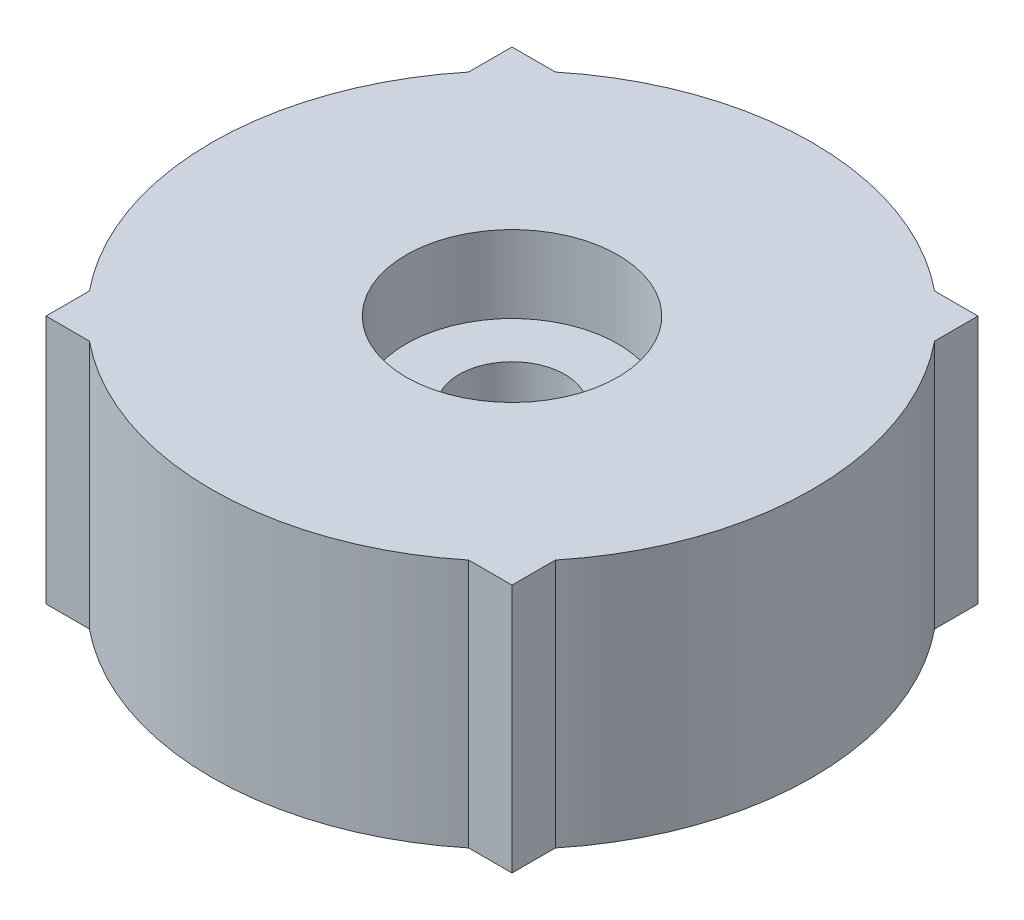
ISO-10303-21;
HEADER;
FILE_DESCRIPTION(('STEP AP214'),'2;1');
FILE_NAME('part.step','',(''),(''),'','','');
FILE_SCHEMA(('AUTOMOTIVE_DESIGN { 1 0 10303 214 1 1 1 1 }'));
ENDSEC;
DATA;
#1=APPLICATION_CONTEXT('core data for automotive mechanical design processes');
#2=APPLICATION_PROTOCOL_DEFINITION('international standard','automotive_design',2000,#1);
#3=PRODUCT_CONTEXT('',#1,'mechanical');
#4=PRODUCT('Part','Part','',(#3));
#5=PRODUCT_RELATED_PRODUCT_CATEGORY('part','',(#4));
#6=PRODUCT_DEFINITION_FORMATION('','',#4);
#7=PRODUCT_DEFINITION_CONTEXT('part definition',#1,'design');
#8=PRODUCT_DEFINITION('design','',#6,#7);
#9=PRODUCT_DEFINITION_SHAPE('','',#8);
#10=(LENGTH_UNIT() NAMED_UNIT(*) SI_UNIT(.MILLI.,.METRE.));
#11=(NAMED_UNIT(*) PLANE_ANGLE_UNIT() SI_UNIT($,.RADIAN.));
#12=(NAMED_UNIT(*) SI_UNIT($,.STERADIAN.) SOLID_ANGLE_UNIT());
#13=UNCERTAINTY_MEASURE_WITH_UNIT(LENGTH_MEASURE(1.E-05),#10,'distance_accuracy_value','');
#14=(GEOMETRIC_REPRESENTATION_CONTEXT(3) GLOBAL_UNCERTAINTY_ASSIGNED_CONTEXT((#13)) GLOBAL_UNIT_ASSIGNED_CONTEXT((#10,
#11,#12)) REPRESENTATION_CONTEXT('',''));
#15=CARTESIAN_POINT('',(0.,0.,0.));
#16=DIRECTION('',(0.,0.,1.));
#17=DIRECTION('',(1.,0.,0.));
#18=AXIS2_PLACEMENT_3D('',#15,#16,#17);
#19=CARTESIAN_POINT('',(-6.05000000000001,4.,6.05000000000002));
#20=DIRECTION('',(0.,0.,-1.));
#21=DIRECTION('',(-1.,0.,0.));
#22=AXIS2_PLACEMENT_3D('',#19,#20,#21);
#23=PLANE('',#22);
#24=DIRECTION('',(1.,0.,0.));
#25=VECTOR('',#24,1.);
#26=CARTESIAN_POINT('',(-6.05000000000001,4.,6.05000000000002));
#27=LINE('',#26,#25);
#28=CARTESIAN_POINT('',(4.92315955459497,4.,6.05000000000002));
#29=VERTEX_POINT('',#28);
#30=CARTESIAN_POINT('',(6.05,4.,6.05000000000002));
#31=VERTEX_POINT('',#30);
#32=EDGE_CURVE('E305',#29,#31,#27,.T.);
#33=ORIENTED_EDGE('',*,*,#32,.F.);
#34=DIRECTION('',(0.,-1.,0.));
#35=VECTOR('',#34,1.);
#36=CARTESIAN_POINT('',(4.92315955459497,26.0617315730203,6.05000000000002));
#37=LINE('',#36,#35);
#38=CARTESIAN_POINT('',(4.923159554595,-2.475,6.05));
#39=VERTEX_POINT('',#38);
#40=EDGE_CURVE('E430',#29,#39,#37,.T.);
#41=ORIENTED_EDGE('',*,*,#40,.T.);
#42=DIRECTION('',(-1.,0.,0.));
#43=VECTOR('',#42,1.);
#44=CARTESIAN_POINT('',(-6.05000000000001,-2.475,6.05));
#45=LINE('',#44,#43);
#46=CARTESIAN_POINT('',(6.05,-2.475,6.05));
#47=VERTEX_POINT('',#46);
#48=EDGE_CURVE('E260',#47,#39,#45,.T.);
#49=ORIENTED_EDGE('',*,*,#48,.F.);
#50=DIRECTION('',(0.,-1.,0.));
#51=VECTOR('',#50,1.);
#52=CARTESIAN_POINT('',(6.05,4.,6.05000000000002));
#53=LINE('',#52,#51);
#54=EDGE_CURVE('E320',#31,#47,#53,.T.);
#55=ORIENTED_EDGE('',*,*,#54,.F.);
#56=EDGE_LOOP('',(#33,#41,#49,#55));
#57=FACE_BOUND('',#56,.T.);
#58=ADVANCED_FACE('F92',(#57),#23,.F.);
#59=CARTESIAN_POINT('',(-6.05000000000001,4.,-6.05));
#60=DIRECTION('',(0.,0.,-1.));
#61=DIRECTION('',(-1.,0.,0.));
#62=AXIS2_PLACEMENT_3D('',#59,#60,#61);
#63=PLANE('',#62);
#64=DIRECTION('',(0.,-1.,0.));
#65=VECTOR('',#64,1.);
#66=CARTESIAN_POINT('',(4.92315955459499,26.0617315730203,-6.05));
#67=LINE('',#66,#65);
#68=CARTESIAN_POINT('',(4.92315955459499,4.,-6.05));
#69=VERTEX_POINT('',#68);
#70=CARTESIAN_POINT('',(4.92315955459502,-2.475,-6.04999999999998));
#71=VERTEX_POINT('',#70);
#72=EDGE_CURVE('E115',#69,#71,#67,.T.);
#73=ORIENTED_EDGE('',*,*,#72,.F.);
#74=DIRECTION('',(1.,0.,0.));
#75=VECTOR('',#74,1.);
#76=CARTESIAN_POINT('',(-6.05000000000001,4.,-6.05));
#77=LINE('',#76,#75);
#78=CARTESIAN_POINT('',(6.05,4.,-6.05));
#79=VERTEX_POINT('',#78);
#80=EDGE_CURVE('E297',#69,#79,#77,.T.);
#81=ORIENTED_EDGE('',*,*,#80,.T.);
#82=DIRECTION('',(0.,-1.,0.));
#83=VECTOR('',#82,1.);
#84=CARTESIAN_POINT('',(6.05,4.,-6.05));
#85=LINE('',#84,#83);
#86=CARTESIAN_POINT('',(6.05,-2.475,-6.04999999999998));
#87=VERTEX_POINT('',#86);
#88=EDGE_CURVE('E312',#79,#87,#85,.T.);
#89=ORIENTED_EDGE('',*,*,#88,.T.);
#90=DIRECTION('',(1.,0.,0.));
#91=VECTOR('',#90,1.);
#92=CARTESIAN_POINT('',(-6.05000000000001,-2.475,-6.04999999999998));
#93=LINE('',#92,#91);
#94=EDGE_CURVE('E255',#71,#87,#93,.T.);
#95=ORIENTED_EDGE('',*,*,#94,.F.);
#96=EDGE_LOOP('',(#73,#81,#89,#95));
#97=FACE_BOUND('',#96,.T.);
#98=ADVANCED_FACE('F382',(#97),#63,.T.);
#99=CARTESIAN_POINT('',(-6.05000000000001,4.,6.05000000000002));
#100=DIRECTION('',(-1.,0.,0.));
#101=DIRECTION('',(0.,0.,1.));
#102=AXIS2_PLACEMENT_3D('',#99,#100,#101);
#103=PLANE('',#102);
#104=DIRECTION('',(0.,-1.,0.));
#105=VECTOR('',#104,1.);
#106=CARTESIAN_POINT('',(-6.05000000000001,26.0617315730203,-4.92315955459498));
#107=LINE('',#106,#105);
#108=CARTESIAN_POINT('',(-6.05000000000001,4.,-4.92315955459498));
#109=VERTEX_POINT('',#108);
#110=CARTESIAN_POINT('',(-6.05000000000001,-2.475,-4.92315955459498));
#111=VERTEX_POINT('',#110);
#112=EDGE_CURVE('E422',#109,#111,#107,.T.);
#113=ORIENTED_EDGE('',*,*,#112,.F.);
#114=DIRECTION('',(0.,0.,-1.));
#115=VECTOR('',#114,1.);
#116=CARTESIAN_POINT('',(-6.05000000000001,4.,6.05000000000002));
#117=LINE('',#116,#115);
#118=CARTESIAN_POINT('',(-6.05000000000001,4.,-6.05));
#119=VERTEX_POINT('',#118);
#120=EDGE_CURVE('E309',#109,#119,#117,.T.);
#121=ORIENTED_EDGE('',*,*,#120,.T.);
#122=DIRECTION('',(0.,-1.,0.));
#123=VECTOR('',#122,1.);
#124=CARTESIAN_POINT('',(-6.05000000000001,4.,-6.05));
#125=LINE('',#124,#123);
#126=CARTESIAN_POINT('',(-6.05000000000001,-2.475,-6.04999999999998));
#127=VERTEX_POINT('',#126);
#128=EDGE_CURVE('E313',#119,#127,#125,.T.);
#129=ORIENTED_EDGE('',*,*,#128,.T.);
#130=DIRECTION('',(0.,0.,-1.));
#131=VECTOR('',#130,1.);
#132=CARTESIAN_POINT('',(-6.05000000000001,-2.475,-6.04999999999998));
#133=LINE('',#132,#131);
#134=EDGE_CURVE('E267',#111,#127,#133,.T.);
#135=ORIENTED_EDGE('',*,*,#134,.F.);
#136=EDGE_LOOP('',(#113,#121,#129,#135));
#137=FACE_BOUND('',#136,.T.);
#138=ADVANCED_FACE('F389',(#137),#103,.T.);
#139=CARTESIAN_POINT('',(6.05,4.,6.05000000000002));
#140=DIRECTION('',(-1.,0.,0.));
#141=DIRECTION('',(0.,0.,1.));
#142=AXIS2_PLACEMENT_3D('',#139,#140,#141);
#143=PLANE('',#142);
#144=DIRECTION('',(0.,0.,-1.));
#145=VECTOR('',#144,1.);
#146=CARTESIAN_POINT('',(6.05,4.,6.05000000000002));
#147=LINE('',#146,#145);
#148=CARTESIAN_POINT('',(6.05,4.,-4.923159554595));
#149=VERTEX_POINT('',#148);
#150=EDGE_CURVE('E248',#149,#79,#147,.T.);
#151=ORIENTED_EDGE('',*,*,#150,.F.);
#152=DIRECTION('',(0.,-1.,0.));
#153=VECTOR('',#152,1.);
#154=CARTESIAN_POINT('',(6.05,26.0617315730203,-4.923159554595));
#155=LINE('',#154,#153);
#156=CARTESIAN_POINT('',(6.05,-2.475,-4.923159554595));
#157=VERTEX_POINT('',#156);
#158=EDGE_CURVE('E231',#149,#157,#155,.T.);
#159=ORIENTED_EDGE('',*,*,#158,.T.);
#160=DIRECTION('',(0.,0.,1.));
#161=VECTOR('',#160,1.);
#162=CARTESIAN_POINT('',(6.05,-2.475,-6.04999999999998));
#163=LINE('',#162,#161);
#164=EDGE_CURVE('E246',#87,#157,#163,.T.);
#165=ORIENTED_EDGE('',*,*,#164,.F.);
#166=ORIENTED_EDGE('',*,*,#88,.F.);
#167=EDGE_LOOP('',(#151,#159,#165,#166));
#168=FACE_BOUND('',#167,.T.);
#169=ADVANCED_FACE('F244',(#168),#143,.F.);
#170=CARTESIAN_POINT('',(-4.923159554595,-2.475,6.05));
#171=VERTEX_POINT('',#170);
#172=CARTESIAN_POINT('',(-6.05000000000001,-2.475,6.05));
#173=VERTEX_POINT('',#172);
#174=EDGE_CURVE('E257',#171,#173,#45,.T.);
#175=ORIENTED_EDGE('',*,*,#174,.F.);
#176=DIRECTION('',(0.,-1.,0.));
#177=VECTOR('',#176,1.);
#178=CARTESIAN_POINT('',(-4.92315955459497,26.0617315730203,6.05000000000002));
#179=LINE('',#178,#177);
#180=CARTESIAN_POINT('',(-4.92315955459497,4.,6.05000000000002));
#181=VERTEX_POINT('',#180);
#182=EDGE_CURVE('E407',#171,#181,#179,.F.);
#183=ORIENTED_EDGE('',*,*,#182,.T.);
#184=CARTESIAN_POINT('',(-6.05000000000001,4.,6.05000000000002));
#185=VERTEX_POINT('',#184);
#186=EDGE_CURVE('E306',#185,#181,#27,.T.);
#187=ORIENTED_EDGE('',*,*,#186,.F.);
#188=DIRECTION('',(0.,-1.,0.));
#189=VECTOR('',#188,1.);
#190=CARTESIAN_POINT('',(-6.05000000000001,4.,6.05000000000002));
#191=LINE('',#190,#189);
#192=EDGE_CURVE('E317',#185,#173,#191,.T.);
#193=ORIENTED_EDGE('',*,*,#192,.T.);
#194=EDGE_LOOP('',(#175,#183,#187,#193));
#195=FACE_BOUND('',#194,.T.);
#196=ADVANCED_FACE('F385',(#195),#23,.F.);
#197=CARTESIAN_POINT('',(0.,2.,0.));
#198=DIRECTION('',(0.,1.,0.));
#199=DIRECTION('',(0.,0.,1.));
#200=AXIS2_PLACEMENT_3D('',#197,#198,#199);
#201=PLANE('',#200);
#202=DIRECTION('',(0.,0.,-1.));
#203=VECTOR('',#202,1.);
#204=CARTESIAN_POINT('',(5.05,2.,5.05));
#205=LINE('',#204,#203);
#206=CARTESIAN_POINT('',(5.05,2.,5.05));
#207=VERTEX_POINT('',#206);
#208=CARTESIAN_POINT('',(5.05,2.,-5.05));
#209=VERTEX_POINT('',#208);
#210=EDGE_CURVE('E287',#207,#209,#205,.T.);
#211=ORIENTED_EDGE('',*,*,#210,.F.);
#212=DIRECTION('',(1.,0.,0.));
#213=VECTOR('',#212,1.);
#214=CARTESIAN_POINT('',(-5.05,2.,5.05));
#215=LINE('',#214,#213);
#216=CARTESIAN_POINT('',(-5.05,2.,5.05));
#217=VERTEX_POINT('',#216);
#218=EDGE_CURVE('E274',#217,#207,#215,.T.);
#219=ORIENTED_EDGE('',*,*,#218,.F.);
#220=DIRECTION('',(0.,0.,1.));
#221=VECTOR('',#220,1.);
#222=CARTESIAN_POINT('',(-5.05,2.,5.05));
#223=LINE('',#222,#221);
#224=CARTESIAN_POINT('',(-5.05,2.,-5.05));
#225=VERTEX_POINT('',#224);
#226=EDGE_CURVE('E279',#225,#217,#223,.T.);
#227=ORIENTED_EDGE('',*,*,#226,.F.);
#228=DIRECTION('',(-1.,0.,0.));
#229=VECTOR('',#228,1.);
#230=CARTESIAN_POINT('',(-5.05,2.,-5.05));
#231=LINE('',#230,#229);
#232=EDGE_CURVE('E283',#209,#225,#231,.T.);
#233=ORIENTED_EDGE('',*,*,#232,.F.);
#234=EDGE_LOOP('',(#211,#219,#227,#233));
#235=FACE_BOUND('',#234,.T.);
#236=DIRECTION('',(0.,0.,-1.));
#237=VECTOR('',#236,1.);
#238=CARTESIAN_POINT('',(3.69999999999999,2.,3.70000000000001));
#239=LINE('',#238,#237);
#240=CARTESIAN_POINT('',(3.69999999999999,2.,3.70000000000001));
#241=VERTEX_POINT('',#240);
#242=CARTESIAN_POINT('',(3.69999999999999,2.,-3.69999999999999));
#243=VERTEX_POINT('',#242);
#244=EDGE_CURVE('E330',#241,#243,#239,.T.);
#245=ORIENTED_EDGE('',*,*,#244,.T.);
#246=DIRECTION('',(-1.,0.,0.));
#247=VECTOR('',#246,1.);
#248=CARTESIAN_POINT('',(-3.70000000000001,2.,-3.69999999999999));
#249=LINE('',#248,#247);
#250=CARTESIAN_POINT('',(-3.70000000000001,2.,-3.69999999999999));
#251=VERTEX_POINT('',#250);
#252=EDGE_CURVE('E332',#243,#251,#249,.T.);
#253=ORIENTED_EDGE('',*,*,#252,.T.);
#254=DIRECTION('',(0.,0.,1.));
#255=VECTOR('',#254,1.);
#256=CARTESIAN_POINT('',(-3.70000000000001,2.,3.70000000000001));
#257=LINE('',#256,#255);
#258=CARTESIAN_POINT('',(-3.70000000000001,2.,3.70000000000001));
#259=VERTEX_POINT('',#258);
#260=EDGE_CURVE('E335',#251,#259,#257,.T.);
#261=ORIENTED_EDGE('',*,*,#260,.T.);
#262=DIRECTION('',(1.,0.,0.));
#263=VECTOR('',#262,1.);
#264=CARTESIAN_POINT('',(-3.70000000000001,2.,3.70000000000001));
#265=LINE('',#264,#263);
#266=EDGE_CURVE('E337',#259,#241,#265,.T.);
#267=ORIENTED_EDGE('',*,*,#266,.T.);
#268=EDGE_LOOP('',(#245,#253,#261,#267));
#269=FACE_BOUND('',#268,.T.);
#270=ADVANCED_FACE('F373',(#235,#269),#201,.F.);
#271=CARTESIAN_POINT('',(0.,2.,0.));
#272=DIRECTION('',(0.,-1.,0.));
#273=DIRECTION('',(0.,0.,-1.));
#274=AXIS2_PLACEMENT_3D('',#271,#272,#273);
#275=PLANE('',#274);
#276=CARTESIAN_POINT('',(0.,2.,0.));
#277=DIRECTION('',(0.,1.,0.));
#278=DIRECTION('',(0.,0.,1.));
#279=AXIS2_PLACEMENT_3D('',#276,#277,#278);
#280=CIRCLE('',#279,1.375);
#281=CARTESIAN_POINT('',(0.,2.,1.37500000000001));
#282=VERTEX_POINT('',#281);
#283=EDGE_CURVE('E324',#282,#282,#280,.T.);
#284=ORIENTED_EDGE('',*,*,#283,.F.);
#285=EDGE_LOOP('',(#284));
#286=FACE_BOUND('',#285,.T.);
#287=CARTESIAN_POINT('',(0.,2.,0.));
#288=DIRECTION('',(0.,1.,0.));
#289=DIRECTION('',(0.,0.,1.));
#290=AXIS2_PLACEMENT_3D('',#287,#288,#289);
#291=CIRCLE('',#290,2.75);
#292=CARTESIAN_POINT('',(0.,2.,2.75000000000001));
#293=VERTEX_POINT('',#292);
#294=EDGE_CURVE('E286',#293,#293,#291,.T.);
#295=ORIENTED_EDGE('',*,*,#294,.T.);
#296=EDGE_LOOP('',(#295));
#297=FACE_BOUND('',#296,.T.);
#298=ADVANCED_FACE('F401',(#286,#297),#275,.F.);
#299=CARTESIAN_POINT('',(0.,0.,0.));
#300=DIRECTION('',(0.,-1.,0.));
#301=DIRECTION('',(0.,0.,-1.));
#302=AXIS2_PLACEMENT_3D('',#299,#300,#301);
#303=PLANE('',#302);
#304=DIRECTION('',(0.,0.,-1.));
#305=VECTOR('',#304,1.);
#306=CARTESIAN_POINT('',(3.69999999999999,0.,3.70000000000001));
#307=LINE('',#306,#305);
#308=CARTESIAN_POINT('',(3.69999999999999,0.,3.70000000000001));
#309=VERTEX_POINT('',#308);
#310=CARTESIAN_POINT('',(3.69999999999999,0.,-3.69999999999999));
#311=VERTEX_POINT('',#310);
#312=EDGE_CURVE('E327',#309,#311,#307,.T.);
#313=ORIENTED_EDGE('',*,*,#312,.F.);
#314=DIRECTION('',(1.,0.,0.));
#315=VECTOR('',#314,1.);
#316=CARTESIAN_POINT('',(-3.70000000000001,0.,3.70000000000001));
#317=LINE('',#316,#315);
#318=CARTESIAN_POINT('',(-3.70000000000001,0.,3.70000000000001));
#319=VERTEX_POINT('',#318);
#320=EDGE_CURVE('E333',#319,#309,#317,.T.);
#321=ORIENTED_EDGE('',*,*,#320,.F.);
#322=DIRECTION('',(0.,0.,1.));
#323=VECTOR('',#322,1.);
#324=CARTESIAN_POINT('',(-3.70000000000001,0.,3.70000000000001));
#325=LINE('',#324,#323);
#326=CARTESIAN_POINT('',(-3.70000000000001,0.,-3.69999999999999));
#327=VERTEX_POINT('',#326);
#328=EDGE_CURVE('E345',#327,#319,#325,.T.);
#329=ORIENTED_EDGE('',*,*,#328,.F.);
#330=DIRECTION('',(-1.,0.,0.));
#331=VECTOR('',#330,1.);
#332=CARTESIAN_POINT('',(-3.70000000000001,0.,-3.69999999999999));
#333=LINE('',#332,#331);
#334=EDGE_CURVE('E343',#311,#327,#333,.T.);
#335=ORIENTED_EDGE('',*,*,#334,.F.);
#336=EDGE_LOOP('',(#313,#321,#329,#335));
#337=FACE_BOUND('',#336,.T.);
#338=CARTESIAN_POINT('',(0.,0.,0.));
#339=DIRECTION('',(0.,1.,0.));
#340=DIRECTION('',(0.,0.,1.));
#341=AXIS2_PLACEMENT_3D('',#338,#339,#340);
#342=CIRCLE('',#341,1.375);
#343=CARTESIAN_POINT('',(0.,0.,1.37500000000001));
#344=VERTEX_POINT('',#343);
#345=EDGE_CURVE('E316',#344,#344,#342,.T.);
#346=ORIENTED_EDGE('',*,*,#345,.T.);
#347=EDGE_LOOP('',(#346));
#348=FACE_BOUND('',#347,.T.);
#349=ADVANCED_FACE('F364',(#337,#348),#303,.T.);
#350=CARTESIAN_POINT('',(3.69999999999999,2.,3.70000000000001));
#351=DIRECTION('',(-1.,0.,0.));
#352=DIRECTION('',(0.,0.,1.));
#353=AXIS2_PLACEMENT_3D('',#350,#351,#352);
#354=PLANE('',#353);
#355=ORIENTED_EDGE('',*,*,#312,.T.);
#356=DIRECTION('',(0.,-1.,0.));
#357=VECTOR('',#356,1.);
#358=CARTESIAN_POINT('',(3.69999999999999,2.,-3.69999999999999));
#359=LINE('',#358,#357);
#360=EDGE_CURVE('E12',#243,#311,#359,.T.);
#361=ORIENTED_EDGE('',*,*,#360,.F.);
#362=ORIENTED_EDGE('',*,*,#244,.F.);
#363=DIRECTION('',(0.,-1.,0.));
#364=VECTOR('',#363,1.);
#365=CARTESIAN_POINT('',(3.69999999999999,2.,3.70000000000001));
#366=LINE('',#365,#364);
#367=EDGE_CURVE('E340',#241,#309,#366,.T.);
#368=ORIENTED_EDGE('',*,*,#367,.T.);
#369=EDGE_LOOP('',(#355,#361,#362,#368));
#370=FACE_BOUND('',#369,.T.);
#371=ADVANCED_FACE('F94',(#370),#354,.F.);
#372=CARTESIAN_POINT('',(-3.70000000000001,2.,-3.69999999999999));
#373=DIRECTION('',(0.,0.,1.));
#374=DIRECTION('',(1.,0.,0.));
#375=AXIS2_PLACEMENT_3D('',#372,#373,#374);
#376=PLANE('',#375);
#377=ORIENTED_EDGE('',*,*,#334,.T.);
#378=DIRECTION('',(0.,-1.,0.));
#379=VECTOR('',#378,1.);
#380=CARTESIAN_POINT('',(-3.70000000000001,2.,-3.69999999999999));
#381=LINE('',#380,#379);
#382=EDGE_CURVE('E100',#251,#327,#381,.T.);
#383=ORIENTED_EDGE('',*,*,#382,.F.);
#384=ORIENTED_EDGE('',*,*,#252,.F.);
#385=ORIENTED_EDGE('',*,*,#360,.T.);
#386=EDGE_LOOP('',(#377,#383,#384,#385));
#387=FACE_BOUND('',#386,.T.);
#388=ADVANCED_FACE('F374',(#387),#376,.F.);
#389=CARTESIAN_POINT('',(-3.70000000000001,2.,3.70000000000001));
#390=DIRECTION('',(1.,0.,0.));
#391=DIRECTION('',(0.,0.,-1.));
#392=AXIS2_PLACEMENT_3D('',#389,#390,#391);
#393=PLANE('',#392);
#394=ORIENTED_EDGE('',*,*,#328,.T.);
#395=DIRECTION('',(0.,-1.,0.));
#396=VECTOR('',#395,1.);
#397=CARTESIAN_POINT('',(-3.70000000000001,2.,3.70000000000001));
#398=LINE('',#397,#396);
#399=EDGE_CURVE('E350',#259,#319,#398,.T.);
#400=ORIENTED_EDGE('',*,*,#399,.F.);
#401=ORIENTED_EDGE('',*,*,#260,.F.);
#402=ORIENTED_EDGE('',*,*,#382,.T.);
#403=EDGE_LOOP('',(#394,#400,#401,#402));
#404=FACE_BOUND('',#403,.T.);
#405=ADVANCED_FACE('F357',(#404),#393,.F.);
#406=CARTESIAN_POINT('',(-3.70000000000001,2.,3.70000000000001));
#407=DIRECTION('',(0.,0.,-1.));
#408=DIRECTION('',(-1.,0.,0.));
#409=AXIS2_PLACEMENT_3D('',#406,#407,#408);
#410=PLANE('',#409);
#411=ORIENTED_EDGE('',*,*,#320,.T.);
#412=ORIENTED_EDGE('',*,*,#367,.F.);
#413=ORIENTED_EDGE('',*,*,#266,.F.);
#414=ORIENTED_EDGE('',*,*,#399,.T.);
#415=EDGE_LOOP('',(#411,#412,#413,#414));
#416=FACE_BOUND('',#415,.T.);
#417=ADVANCED_FACE('F368',(#416),#410,.F.);
#418=CARTESIAN_POINT('',(0.,2.,0.));
#419=DIRECTION('',(0.,-1.,0.));
#420=DIRECTION('',(0.,0.,-1.));
#421=AXIS2_PLACEMENT_3D('',#418,#419,#420);
#422=CYLINDRICAL_SURFACE('',#421,1.375);
#423=ORIENTED_EDGE('',*,*,#283,.T.);
#424=EDGE_LOOP('',(#423));
#425=FACE_BOUND('',#424,.T.);
#426=ORIENTED_EDGE('',*,*,#345,.F.);
#427=EDGE_LOOP('',(#426));
#428=FACE_BOUND('',#427,.T.);
#429=ADVANCED_FACE('F472',(#425,#428),#422,.F.);
#430=CARTESIAN_POINT('',(0.,4.,0.));
#431=DIRECTION('',(0.,1.,0.));
#432=DIRECTION('',(0.,0.,1.));
#433=AXIS2_PLACEMENT_3D('',#430,#431,#432);
#434=PLANE('',#433);
#435=CARTESIAN_POINT('',(0.,4.,0.));
#436=DIRECTION('',(0.,1.,0.));
#437=DIRECTION('',(0.,0.,1.));
#438=AXIS2_PLACEMENT_3D('',#435,#436,#437);
#439=CIRCLE('',#438,2.75);
#440=CARTESIAN_POINT('',(0.,4.,2.75000000000001));
#441=VERTEX_POINT('',#440);
#442=EDGE_CURVE('E294',#441,#441,#439,.T.);
#443=ORIENTED_EDGE('',*,*,#442,.F.);
#444=EDGE_LOOP('',(#443));
#445=FACE_BOUND('',#444,.T.);
#446=ORIENTED_EDGE('',*,*,#186,.T.);
#447=CARTESIAN_POINT('',(0.,4.,0.));
#448=DIRECTION('',(0.,1.,0.));
#449=DIRECTION('',(0.,0.,1.));
#450=AXIS2_PLACEMENT_3D('',#447,#448,#449);
#451=CIRCLE('',#450,7.8);
#452=EDGE_CURVE('E107',#29,#181,#451,.F.);
#453=ORIENTED_EDGE('',*,*,#452,.F.);
#454=ORIENTED_EDGE('',*,*,#32,.T.);
#455=CARTESIAN_POINT('',(6.05,4.,4.923159554595));
#456=VERTEX_POINT('',#455);
#457=EDGE_CURVE('E302',#31,#456,#147,.T.);
#458=ORIENTED_EDGE('',*,*,#457,.T.);
#459=EDGE_CURVE('E417',#149,#456,#451,.F.);
#460=ORIENTED_EDGE('',*,*,#459,.F.);
#461=ORIENTED_EDGE('',*,*,#150,.T.);
#462=ORIENTED_EDGE('',*,*,#80,.F.);
#463=CARTESIAN_POINT('',(-4.923159554595,4.,-6.05));
#464=VERTEX_POINT('',#463);
#465=EDGE_CURVE('E497',#464,#69,#451,.F.);
#466=ORIENTED_EDGE('',*,*,#465,.F.);
#467=EDGE_CURVE('E300',#119,#464,#77,.T.);
#468=ORIENTED_EDGE('',*,*,#467,.F.);
#469=ORIENTED_EDGE('',*,*,#120,.F.);
#470=CARTESIAN_POINT('',(-6.05000000000001,4.,4.92315955459498));
#471=VERTEX_POINT('',#470);
#472=EDGE_CURVE('E418',#471,#109,#451,.F.);
#473=ORIENTED_EDGE('',*,*,#472,.F.);
#474=EDGE_CURVE('E310',#185,#471,#117,.T.);
#475=ORIENTED_EDGE('',*,*,#474,.F.);
#476=EDGE_LOOP('',(#446,#453,#454,#458,#460,#461,#462,#466,#468,#469,#473,#475));
#477=FACE_BOUND('',#476,.T.);
#478=ADVANCED_FACE('F470',(#445,#477),#434,.T.);
#479=DIRECTION('',(0.,-1.,0.));
#480=VECTOR('',#479,1.);
#481=CARTESIAN_POINT('',(-4.92315955459499,26.0617315730203,-6.05));
#482=LINE('',#481,#480);
#483=CARTESIAN_POINT('',(-4.92315955459502,-2.475,-6.04999999999998));
#484=VERTEX_POINT('',#483);
#485=EDGE_CURVE('E425',#484,#464,#482,.F.);
#486=ORIENTED_EDGE('',*,*,#485,.F.);
#487=EDGE_CURVE('E270',#127,#484,#93,.T.);
#488=ORIENTED_EDGE('',*,*,#487,.F.);
#489=ORIENTED_EDGE('',*,*,#128,.F.);
#490=ORIENTED_EDGE('',*,*,#467,.T.);
#491=EDGE_LOOP('',(#486,#488,#489,#490));
#492=FACE_BOUND('',#491,.T.);
#493=ADVANCED_FACE('F391',(#492),#63,.T.);
#494=DIRECTION('',(0.,-1.,0.));
#495=VECTOR('',#494,1.);
#496=CARTESIAN_POINT('',(-6.05000000000001,26.0617315730203,4.92315955459498));
#497=LINE('',#496,#495);
#498=CARTESIAN_POINT('',(-6.05000000000001,-2.475,4.92315955459498));
#499=VERTEX_POINT('',#498);
#500=EDGE_CURVE('E249',#499,#471,#497,.F.);
#501=ORIENTED_EDGE('',*,*,#500,.F.);
#502=EDGE_CURVE('E268',#173,#499,#133,.T.);
#503=ORIENTED_EDGE('',*,*,#502,.F.);
#504=ORIENTED_EDGE('',*,*,#192,.F.);
#505=ORIENTED_EDGE('',*,*,#474,.T.);
#506=EDGE_LOOP('',(#501,#503,#504,#505));
#507=FACE_BOUND('',#506,.T.);
#508=ADVANCED_FACE('F474',(#507),#103,.T.);
#509=CARTESIAN_POINT('',(6.05,-2.475,4.923159554595));
#510=VERTEX_POINT('',#509);
#511=EDGE_CURVE('E258',#510,#47,#163,.T.);
#512=ORIENTED_EDGE('',*,*,#511,.F.);
#513=DIRECTION('',(0.,-1.,0.));
#514=VECTOR('',#513,1.);
#515=CARTESIAN_POINT('',(6.05,26.0617315730203,4.923159554595));
#516=LINE('',#515,#514);
#517=EDGE_CURVE('E234',#510,#456,#516,.F.);
#518=ORIENTED_EDGE('',*,*,#517,.T.);
#519=ORIENTED_EDGE('',*,*,#457,.F.);
#520=ORIENTED_EDGE('',*,*,#54,.T.);
#521=EDGE_LOOP('',(#512,#518,#519,#520));
#522=FACE_BOUND('',#521,.T.);
#523=ADVANCED_FACE('F404',(#522),#143,.F.);
#524=CARTESIAN_POINT('',(0.,4.,0.));
#525=DIRECTION('',(0.,-1.,0.));
#526=DIRECTION('',(0.,0.,-1.));
#527=AXIS2_PLACEMENT_3D('',#524,#525,#526);
#528=CYLINDRICAL_SURFACE('',#527,2.75);
#529=ORIENTED_EDGE('',*,*,#442,.T.);
#530=EDGE_LOOP('',(#529));
#531=FACE_BOUND('',#530,.T.);
#532=ORIENTED_EDGE('',*,*,#294,.F.);
#533=EDGE_LOOP('',(#532));
#534=FACE_BOUND('',#533,.T.);
#535=ADVANCED_FACE('F463',(#531,#534),#528,.F.);
#536=CARTESIAN_POINT('',(5.05,-17.1119841047144,5.05));
#537=DIRECTION('',(1.,0.,0.));
#538=DIRECTION('',(0.,0.,-1.));
#539=AXIS2_PLACEMENT_3D('',#536,#537,#538);
#540=PLANE('',#539);
#541=ORIENTED_EDGE('',*,*,#210,.T.);
#542=DIRECTION('',(0.,1.,0.));
#543=VECTOR('',#542,1.);
#544=CARTESIAN_POINT('',(5.05,-17.1119841047144,-5.05));
#545=LINE('',#544,#543);
#546=CARTESIAN_POINT('',(5.05,-2.475,-5.04999999999998));
#547=VERTEX_POINT('',#546);
#548=EDGE_CURVE('E282',#547,#209,#545,.T.);
#549=ORIENTED_EDGE('',*,*,#548,.F.);
#550=DIRECTION('',(0.,0.,1.));
#551=VECTOR('',#550,1.);
#552=CARTESIAN_POINT('',(5.05,-2.475,-5.04999999999998));
#553=LINE('',#552,#551);
#554=CARTESIAN_POINT('',(5.05,-2.475,5.05));
#555=VERTEX_POINT('',#554);
#556=EDGE_CURVE('E432',#547,#555,#553,.T.);
#557=ORIENTED_EDGE('',*,*,#556,.T.);
#558=DIRECTION('',(0.,1.,0.));
#559=VECTOR('',#558,1.);
#560=CARTESIAN_POINT('',(5.05,-17.1119841047144,5.05));
#561=LINE('',#560,#559);
#562=EDGE_CURVE('E273',#555,#207,#561,.T.);
#563=ORIENTED_EDGE('',*,*,#562,.T.);
#564=EDGE_LOOP('',(#541,#549,#557,#563));
#565=FACE_BOUND('',#564,.T.);
#566=ADVANCED_FACE('F449',(#565),#540,.F.);
#567=CARTESIAN_POINT('',(-5.05,-17.1119841047144,5.05));
#568=DIRECTION('',(0.,0.,1.));
#569=DIRECTION('',(1.,0.,0.));
#570=AXIS2_PLACEMENT_3D('',#567,#568,#569);
#571=PLANE('',#570);
#572=ORIENTED_EDGE('',*,*,#218,.T.);
#573=ORIENTED_EDGE('',*,*,#562,.F.);
#574=DIRECTION('',(-1.,0.,0.));
#575=VECTOR('',#574,1.);
#576=CARTESIAN_POINT('',(-5.05000000000002,-2.475,5.05));
#577=LINE('',#576,#575);
#578=CARTESIAN_POINT('',(-5.05000000000002,-2.475,5.05));
#579=VERTEX_POINT('',#578);
#580=EDGE_CURVE('E435',#555,#579,#577,.T.);
#581=ORIENTED_EDGE('',*,*,#580,.T.);
#582=DIRECTION('',(0.,1.,0.));
#583=VECTOR('',#582,1.);
#584=CARTESIAN_POINT('',(-5.05,-17.1119841047144,5.05));
#585=LINE('',#584,#583);
#586=EDGE_CURVE('E278',#579,#217,#585,.T.);
#587=ORIENTED_EDGE('',*,*,#586,.T.);
#588=EDGE_LOOP('',(#572,#573,#581,#587));
#589=FACE_BOUND('',#588,.T.);
#590=ADVANCED_FACE('F455',(#589),#571,.F.);
#591=CARTESIAN_POINT('',(-5.05,-17.1119841047144,5.05));
#592=DIRECTION('',(-1.,0.,0.));
#593=DIRECTION('',(0.,0.,1.));
#594=AXIS2_PLACEMENT_3D('',#591,#592,#593);
#595=PLANE('',#594);
#596=ORIENTED_EDGE('',*,*,#226,.T.);
#597=ORIENTED_EDGE('',*,*,#586,.F.);
#598=DIRECTION('',(0.,0.,-1.));
#599=VECTOR('',#598,1.);
#600=CARTESIAN_POINT('',(-5.05000000000002,-2.475,-5.04999999999998));
#601=LINE('',#600,#599);
#602=CARTESIAN_POINT('',(-5.05000000000002,-2.475,-5.04999999999998));
#603=VERTEX_POINT('',#602);
#604=EDGE_CURVE('E437',#579,#603,#601,.T.);
#605=ORIENTED_EDGE('',*,*,#604,.T.);
#606=DIRECTION('',(0.,1.,0.));
#607=VECTOR('',#606,1.);
#608=CARTESIAN_POINT('',(-5.05,-17.1119841047144,-5.05));
#609=LINE('',#608,#607);
#610=EDGE_CURVE('E277',#603,#225,#609,.T.);
#611=ORIENTED_EDGE('',*,*,#610,.T.);
#612=EDGE_LOOP('',(#596,#597,#605,#611));
#613=FACE_BOUND('',#612,.T.);
#614=ADVANCED_FACE('F453',(#613),#595,.F.);
#615=CARTESIAN_POINT('',(-5.05,-17.1119841047144,-5.05));
#616=DIRECTION('',(0.,0.,-1.));
#617=DIRECTION('',(-1.,0.,0.));
#618=AXIS2_PLACEMENT_3D('',#615,#616,#617);
#619=PLANE('',#618);
#620=ORIENTED_EDGE('',*,*,#232,.T.);
#621=ORIENTED_EDGE('',*,*,#610,.F.);
#622=DIRECTION('',(1.,0.,0.));
#623=VECTOR('',#622,1.);
#624=CARTESIAN_POINT('',(-5.05000000000002,-2.475,-5.04999999999998));
#625=LINE('',#624,#623);
#626=EDGE_CURVE('E262',#603,#547,#625,.T.);
#627=ORIENTED_EDGE('',*,*,#626,.T.);
#628=ORIENTED_EDGE('',*,*,#548,.T.);
#629=EDGE_LOOP('',(#620,#621,#627,#628));
#630=FACE_BOUND('',#629,.T.);
#631=ADVANCED_FACE('F445',(#630),#619,.F.);
#632=CARTESIAN_POINT('',(0.,-2.475,0.));
#633=DIRECTION('',(0.,1.,0.));
#634=DIRECTION('',(0.,0.,1.));
#635=AXIS2_PLACEMENT_3D('',#632,#633,#634);
#636=PLANE('',#635);
#637=ORIENTED_EDGE('',*,*,#502,.T.);
#638=CARTESIAN_POINT('',(0.,-2.475,0.));
#639=DIRECTION('',(0.,-1.,0.));
#640=DIRECTION('',(0.,0.,-1.));
#641=AXIS2_PLACEMENT_3D('',#638,#639,#640);
#642=CIRCLE('',#641,7.8);
#643=EDGE_CURVE('E414',#499,#111,#642,.T.);
#644=ORIENTED_EDGE('',*,*,#643,.T.);
#645=ORIENTED_EDGE('',*,*,#134,.T.);
#646=ORIENTED_EDGE('',*,*,#487,.T.);
#647=EDGE_CURVE('E240',#484,#71,#642,.T.);
#648=ORIENTED_EDGE('',*,*,#647,.T.);
#649=ORIENTED_EDGE('',*,*,#94,.T.);
#650=ORIENTED_EDGE('',*,*,#164,.T.);
#651=EDGE_CURVE('E228',#157,#510,#642,.T.);
#652=ORIENTED_EDGE('',*,*,#651,.T.);
#653=ORIENTED_EDGE('',*,*,#511,.T.);
#654=ORIENTED_EDGE('',*,*,#48,.T.);
#655=EDGE_CURVE('E238',#39,#171,#642,.T.);
#656=ORIENTED_EDGE('',*,*,#655,.T.);
#657=ORIENTED_EDGE('',*,*,#174,.T.);
#658=EDGE_LOOP('',(#637,#644,#645,#646,#648,#649,#650,#652,#653,#654,#656,#657));
#659=FACE_BOUND('',#658,.T.);
#660=ORIENTED_EDGE('',*,*,#556,.F.);
#661=ORIENTED_EDGE('',*,*,#626,.F.);
#662=ORIENTED_EDGE('',*,*,#604,.F.);
#663=ORIENTED_EDGE('',*,*,#580,.F.);
#664=EDGE_LOOP('',(#660,#661,#662,#663));
#665=FACE_BOUND('',#664,.T.);
#666=ADVANCED_FACE('F252',(#659,#665),#636,.F.);
#667=CARTESIAN_POINT('',(0.,26.0617315730203,0.));
#668=DIRECTION('',(0.,-1.,0.));
#669=DIRECTION('',(0.,0.,-1.));
#670=AXIS2_PLACEMENT_3D('',#667,#668,#669);
#671=CYLINDRICAL_SURFACE('',#670,7.8);
#672=ORIENTED_EDGE('',*,*,#158,.F.);
#673=ORIENTED_EDGE('',*,*,#459,.T.);
#674=ORIENTED_EDGE('',*,*,#517,.F.);
#675=ORIENTED_EDGE('',*,*,#651,.F.);
#676=EDGE_LOOP('',(#672,#673,#674,#675));
#677=FACE_BOUND('',#676,.T.);
#678=ADVANCED_FACE('F230',(#677),#671,.T.);
#679=ORIENTED_EDGE('',*,*,#472,.T.);
#680=ORIENTED_EDGE('',*,*,#112,.T.);
#681=ORIENTED_EDGE('',*,*,#643,.F.);
#682=ORIENTED_EDGE('',*,*,#500,.T.);
#683=EDGE_LOOP('',(#679,#680,#681,#682));
#684=FACE_BOUND('',#683,.T.);
#685=ADVANCED_FACE('F496',(#684),#671,.T.);
#686=ORIENTED_EDGE('',*,*,#465,.T.);
#687=ORIENTED_EDGE('',*,*,#72,.T.);
#688=ORIENTED_EDGE('',*,*,#647,.F.);
#689=ORIENTED_EDGE('',*,*,#485,.T.);
#690=EDGE_LOOP('',(#686,#687,#688,#689));
#691=FACE_BOUND('',#690,.T.);
#692=ADVANCED_FACE('F504',(#691),#671,.T.);
#693=ORIENTED_EDGE('',*,*,#40,.F.);
#694=ORIENTED_EDGE('',*,*,#452,.T.);
#695=ORIENTED_EDGE('',*,*,#182,.F.);
#696=ORIENTED_EDGE('',*,*,#655,.F.);
#697=EDGE_LOOP('',(#693,#694,#695,#696));
#698=FACE_BOUND('',#697,.T.);
#699=ADVANCED_FACE('F502',(#698),#671,.T.);
#700=CLOSED_SHELL('',(#58,#98,#138,#169,#196,#270,#298,#349,#371,#388,#405,#417,#429,#478,#493,
#508,#523,#535,#566,#590,#614,#631,#666,#678,#685,#692,#699));
#701=MANIFOLD_SOLID_BREP('B2',#700);
#702=ADVANCED_BREP_SHAPE_REPRESENTATION('',(#18,#701),#14);
#703=SHAPE_DEFINITION_REPRESENTATION(#9,#702);
ENDSEC;
END-ISO-10303-21;
